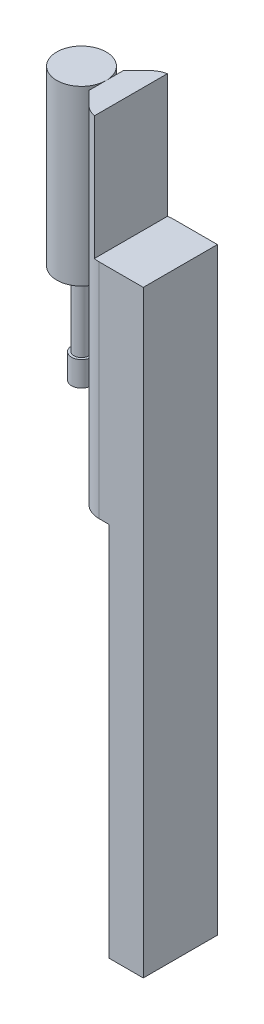
ISO-10303-21;
HEADER;
FILE_DESCRIPTION(('STEP AP214'),'2;1');
FILE_NAME('part.step','',(''),(''),'','','');
FILE_SCHEMA(('AUTOMOTIVE_DESIGN { 1 0 10303 214 1 1 1 1 }'));
ENDSEC;
DATA;
#1=APPLICATION_CONTEXT('core data for automotive mechanical design processes');
#2=APPLICATION_PROTOCOL_DEFINITION('international standard','automotive_design',2000,#1);
#3=PRODUCT_CONTEXT('',#1,'mechanical');
#4=PRODUCT('Part','Part','',(#3));
#5=PRODUCT_RELATED_PRODUCT_CATEGORY('part','',(#4));
#6=PRODUCT_DEFINITION_FORMATION('','',#4);
#7=PRODUCT_DEFINITION_CONTEXT('part definition',#1,'design');
#8=PRODUCT_DEFINITION('design','',#6,#7);
#9=PRODUCT_DEFINITION_SHAPE('','',#8);
#10=(LENGTH_UNIT() NAMED_UNIT(*) SI_UNIT(.MILLI.,.METRE.));
#11=(NAMED_UNIT(*) PLANE_ANGLE_UNIT() SI_UNIT($,.RADIAN.));
#12=(NAMED_UNIT(*) SI_UNIT($,.STERADIAN.) SOLID_ANGLE_UNIT());
#13=UNCERTAINTY_MEASURE_WITH_UNIT(LENGTH_MEASURE(1.E-05),#10,'distance_accuracy_value','');
#14=(GEOMETRIC_REPRESENTATION_CONTEXT(3) GLOBAL_UNCERTAINTY_ASSIGNED_CONTEXT((#13)) GLOBAL_UNIT_ASSIGNED_CONTEXT((#10,
#11,#12)) REPRESENTATION_CONTEXT('',''));
#15=CARTESIAN_POINT('',(0.,0.,0.));
#16=DIRECTION('',(0.,0.,1.));
#17=DIRECTION('',(1.,0.,0.));
#18=AXIS2_PLACEMENT_3D('',#15,#16,#17);
#19=CARTESIAN_POINT('',(-10.,70.,-15.));
#20=DIRECTION('',(0.,1.,0.));
#21=DIRECTION('',(0.,0.,1.));
#22=AXIS2_PLACEMENT_3D('',#19,#20,#21);
#23=CYLINDRICAL_SURFACE('',#22,10.);
#24=CARTESIAN_POINT('',(-10.,70.,-15.));
#25=DIRECTION('',(0.,1.,0.));
#26=DIRECTION('',(0.,0.,1.));
#27=AXIS2_PLACEMENT_3D('',#24,#25,#26);
#28=CIRCLE('',#27,10.);
#29=CARTESIAN_POINT('',(-10.,70.,-5.));
#30=VERTEX_POINT('',#29);
#31=EDGE_CURVE('E47',#30,#30,#28,.T.);
#32=ORIENTED_EDGE('',*,*,#31,.T.);
#33=EDGE_LOOP('',(#32));
#34=FACE_BOUND('',#33,.T.);
#35=CARTESIAN_POINT('',(-10.,140.,-15.));
#36=DIRECTION('',(0.,1.,0.));
#37=DIRECTION('',(0.,0.,1.));
#38=AXIS2_PLACEMENT_3D('',#35,#36,#37);
#39=CIRCLE('',#38,10.);
#40=CARTESIAN_POINT('',(-10.,140.,-5.));
#41=VERTEX_POINT('',#40);
#42=EDGE_CURVE('E43',#41,#41,#39,.T.);
#43=ORIENTED_EDGE('',*,*,#42,.F.);
#44=EDGE_LOOP('',(#43));
#45=FACE_BOUND('',#44,.T.);
#46=ADVANCED_FACE('F40',(#34,#45),#23,.T.);
#47=CARTESIAN_POINT('',(0.,70.,0.));
#48=DIRECTION('',(0.,1.,0.));
#49=DIRECTION('',(0.,0.,1.));
#50=AXIS2_PLACEMENT_3D('',#47,#48,#49);
#51=PLANE('',#50);
#52=CARTESIAN_POINT('',(-10.,70.,-15.));
#53=DIRECTION('',(0.,-1.,0.));
#54=DIRECTION('',(0.,0.,-1.));
#55=AXIS2_PLACEMENT_3D('',#52,#53,#54);
#56=CIRCLE('',#55,3.);
#57=CARTESIAN_POINT('',(-10.,70.,-18.));
#58=VERTEX_POINT('',#57);
#59=EDGE_CURVE('E11',#58,#58,#56,.T.);
#60=ORIENTED_EDGE('',*,*,#59,.F.);
#61=EDGE_LOOP('',(#60));
#62=FACE_BOUND('',#61,.T.);
#63=ORIENTED_EDGE('',*,*,#31,.F.);
#64=EDGE_LOOP('',(#63));
#65=FACE_BOUND('',#64,.T.);
#66=ADVANCED_FACE('F81',(#62,#65),#51,.F.);
#67=CARTESIAN_POINT('',(0.,140.,0.));
#68=DIRECTION('',(0.,1.,0.));
#69=DIRECTION('',(0.,0.,1.));
#70=AXIS2_PLACEMENT_3D('',#67,#68,#69);
#71=PLANE('',#70);
#72=ORIENTED_EDGE('',*,*,#42,.T.);
#73=EDGE_LOOP('',(#72));
#74=FACE_BOUND('',#73,.T.);
#75=ADVANCED_FACE('F86',(#74),#71,.T.);
#76=CARTESIAN_POINT('',(-10.,40.,-15.));
#77=DIRECTION('',(0.,1.,0.));
#78=DIRECTION('',(0.,0.,1.));
#79=AXIS2_PLACEMENT_3D('',#76,#77,#78);
#80=CYLINDRICAL_SURFACE('',#79,3.);
#81=CARTESIAN_POINT('',(-10.,40.,-15.));
#82=DIRECTION('',(0.,-1.,0.));
#83=DIRECTION('',(0.,0.,-1.));
#84=AXIS2_PLACEMENT_3D('',#81,#82,#83);
#85=CIRCLE('',#84,3.);
#86=CARTESIAN_POINT('',(-10.,40.,-18.));
#87=VERTEX_POINT('',#86);
#88=EDGE_CURVE('E53',#87,#87,#85,.T.);
#89=ORIENTED_EDGE('',*,*,#88,.F.);
#90=EDGE_LOOP('',(#89));
#91=FACE_BOUND('',#90,.T.);
#92=ORIENTED_EDGE('',*,*,#59,.T.);
#93=EDGE_LOOP('',(#92));
#94=FACE_BOUND('',#93,.T.);
#95=ADVANCED_FACE('F68',(#91,#94),#80,.T.);
#96=CARTESIAN_POINT('',(-10.,30.,-15.));
#97=DIRECTION('',(0.,1.,0.));
#98=DIRECTION('',(0.,0.,1.));
#99=AXIS2_PLACEMENT_3D('',#96,#97,#98);
#100=CYLINDRICAL_SURFACE('',#99,4.);
#101=CARTESIAN_POINT('',(-10.,30.,-15.));
#102=DIRECTION('',(0.,-1.,0.));
#103=DIRECTION('',(0.,0.,-1.));
#104=AXIS2_PLACEMENT_3D('',#101,#102,#103);
#105=CIRCLE('',#104,4.);
#106=CARTESIAN_POINT('',(-10.,30.,-19.));
#107=VERTEX_POINT('',#106);
#108=EDGE_CURVE('E56',#107,#107,#105,.T.);
#109=ORIENTED_EDGE('',*,*,#108,.F.);
#110=EDGE_LOOP('',(#109));
#111=FACE_BOUND('',#110,.T.);
#112=CARTESIAN_POINT('',(-10.,40.,-15.));
#113=DIRECTION('',(0.,-1.,0.));
#114=DIRECTION('',(0.,0.,-1.));
#115=AXIS2_PLACEMENT_3D('',#112,#113,#114);
#116=CIRCLE('',#115,4.);
#117=CARTESIAN_POINT('',(-10.,40.,-19.));
#118=VERTEX_POINT('',#117);
#119=EDGE_CURVE('E57',#118,#118,#116,.T.);
#120=ORIENTED_EDGE('',*,*,#119,.T.);
#121=EDGE_LOOP('',(#120));
#122=FACE_BOUND('',#121,.T.);
#123=ADVANCED_FACE('F65',(#111,#122),#100,.T.);
#124=CARTESIAN_POINT('',(-10.,30.,-15.));
#125=DIRECTION('',(0.,-1.,0.));
#126=DIRECTION('',(0.,0.,-1.));
#127=AXIS2_PLACEMENT_3D('',#124,#125,#126);
#128=PLANE('',#127);
#129=ORIENTED_EDGE('',*,*,#108,.T.);
#130=EDGE_LOOP('',(#129));
#131=FACE_BOUND('',#130,.T.);
#132=ADVANCED_FACE('F63',(#131),#128,.T.);
#133=CARTESIAN_POINT('',(-10.,40.,-15.));
#134=DIRECTION('',(0.,-1.,0.));
#135=DIRECTION('',(0.,0.,-1.));
#136=AXIS2_PLACEMENT_3D('',#133,#134,#135);
#137=PLANE('',#136);
#138=ORIENTED_EDGE('',*,*,#88,.T.);
#139=EDGE_LOOP('',(#138));
#140=FACE_BOUND('',#139,.T.);
#141=ORIENTED_EDGE('',*,*,#119,.F.);
#142=EDGE_LOOP('',(#141));
#143=FACE_BOUND('',#142,.T.);
#144=ADVANCED_FACE('F72',(#140,#143),#137,.F.);
#145=CLOSED_SHELL('',(#46,#66,#75,#95,#123,#132,#144));
#146=MANIFOLD_SOLID_BREP('B2',#145);
#147=CARTESIAN_POINT('',(0.,90.,0.));
#148=DIRECTION('',(0.,-1.,0.));
#149=DIRECTION('',(0.,0.,-1.));
#150=AXIS2_PLACEMENT_3D('',#147,#148,#149);
#151=PLANE('',#150);
#152=DIRECTION('',(-1.,0.,0.));
#153=VECTOR('',#152,1.);
#154=CARTESIAN_POINT('',(0.,90.,-30.));
#155=LINE('',#154,#153);
#156=CARTESIAN_POINT('',(30.,90.,-30.));
#157=VERTEX_POINT('',#156);
#158=CARTESIAN_POINT('',(12.1421356237309,90.,-30.));
#159=VERTEX_POINT('',#158);
#160=EDGE_CURVE('E277',#157,#159,#155,.T.);
#161=ORIENTED_EDGE('',*,*,#160,.T.);
#162=CARTESIAN_POINT('',(12.1421356237309,90.,-20.));
#163=DIRECTION('',(0.,-1.,0.));
#164=DIRECTION('',(0.,0.,-1.));
#165=AXIS2_PLACEMENT_3D('',#162,#163,#164);
#166=CIRCLE('',#165,10.);
#167=CARTESIAN_POINT('',(10.,90.,-29.7678684967368));
#168=VERTEX_POINT('',#167);
#169=EDGE_CURVE('E305',#159,#168,#166,.F.);
#170=ORIENTED_EDGE('',*,*,#169,.T.);
#171=DIRECTION('',(0.,0.,-1.));
#172=VECTOR('',#171,1.);
#173=CARTESIAN_POINT('',(10.,90.,0.));
#174=LINE('',#173,#172);
#175=CARTESIAN_POINT('',(10.,90.,-0.232131503263216));
#176=VERTEX_POINT('',#175);
#177=EDGE_CURVE('E264',#176,#168,#174,.T.);
#178=ORIENTED_EDGE('',*,*,#177,.F.);
#179=CARTESIAN_POINT('',(12.1421356237309,90.,-10.));
#180=DIRECTION('',(0.,-1.,0.));
#181=DIRECTION('',(0.,0.,-1.));
#182=AXIS2_PLACEMENT_3D('',#179,#180,#181);
#183=CIRCLE('',#182,10.);
#184=CARTESIAN_POINT('',(12.1421356237309,90.,0.));
#185=VERTEX_POINT('',#184);
#186=EDGE_CURVE('E303',#176,#185,#183,.F.);
#187=ORIENTED_EDGE('',*,*,#186,.T.);
#188=DIRECTION('',(1.,0.,0.));
#189=VECTOR('',#188,1.);
#190=CARTESIAN_POINT('',(0.,90.,0.));
#191=LINE('',#190,#189);
#192=CARTESIAN_POINT('',(30.,90.,0.));
#193=VERTEX_POINT('',#192);
#194=EDGE_CURVE('E273',#185,#193,#191,.T.);
#195=ORIENTED_EDGE('',*,*,#194,.T.);
#196=DIRECTION('',(0.,0.,-1.));
#197=VECTOR('',#196,1.);
#198=CARTESIAN_POINT('',(30.,90.,0.));
#199=LINE('',#198,#197);
#200=EDGE_CURVE('E235',#193,#157,#199,.T.);
#201=ORIENTED_EDGE('',*,*,#200,.T.);
#202=EDGE_LOOP('',(#161,#170,#178,#187,#195,#201));
#203=FACE_BOUND('',#202,.T.);
#204=ADVANCED_FACE('F141',(#203),#151,.F.);
#205=CARTESIAN_POINT('',(0.,90.,0.));
#206=DIRECTION('',(1.,0.,0.));
#207=DIRECTION('',(0.,0.,-1.));
#208=AXIS2_PLACEMENT_3D('',#205,#206,#207);
#209=PLANE('',#208);
#210=DIRECTION('',(0.,0.,1.));
#211=VECTOR('',#210,1.);
#212=CARTESIAN_POINT('',(0.,140.,0.));
#213=LINE('',#212,#211);
#214=CARTESIAN_POINT('',(0.,140.,-22.));
#215=VERTEX_POINT('',#214);
#216=CARTESIAN_POINT('',(0.,140.,-8.));
#217=VERTEX_POINT('',#216);
#218=EDGE_CURVE('E263',#215,#217,#213,.T.);
#219=ORIENTED_EDGE('',*,*,#218,.F.);
#220=DIRECTION('',(0.,-1.,0.));
#221=VECTOR('',#220,1.);
#222=CARTESIAN_POINT('',(0.,90.,-22.));
#223=LINE('',#222,#221);
#224=CARTESIAN_POINT('',(0.,0.,-22.));
#225=VERTEX_POINT('',#224);
#226=EDGE_CURVE('E287',#215,#225,#223,.T.);
#227=ORIENTED_EDGE('',*,*,#226,.T.);
#228=DIRECTION('',(0.,0.,1.));
#229=VECTOR('',#228,1.);
#230=CARTESIAN_POINT('',(0.,0.,0.));
#231=LINE('',#230,#229);
#232=CARTESIAN_POINT('',(0.,0.,-8.));
#233=VERTEX_POINT('',#232);
#234=EDGE_CURVE('E270',#225,#233,#231,.T.);
#235=ORIENTED_EDGE('',*,*,#234,.T.);
#236=DIRECTION('',(0.,1.,0.));
#237=VECTOR('',#236,1.);
#238=CARTESIAN_POINT('',(0.,90.,-8.));
#239=LINE('',#238,#237);
#240=EDGE_CURVE('E238',#233,#217,#239,.T.);
#241=ORIENTED_EDGE('',*,*,#240,.T.);
#242=EDGE_LOOP('',(#219,#227,#235,#241));
#243=FACE_BOUND('',#242,.T.);
#244=ADVANCED_FACE('F342',(#243),#209,.F.);
#245=CARTESIAN_POINT('',(0.,90.,0.));
#246=DIRECTION('',(0.,0.,-1.));
#247=DIRECTION('',(-1.,0.,0.));
#248=AXIS2_PLACEMENT_3D('',#245,#246,#247);
#249=PLANE('',#248);
#250=ORIENTED_EDGE('',*,*,#194,.F.);
#251=DIRECTION('',(0.,1.,0.));
#252=VECTOR('',#251,1.);
#253=CARTESIAN_POINT('',(12.1421356237309,0.,0.));
#254=LINE('',#253,#252);
#255=CARTESIAN_POINT('',(12.1421356237309,0.,0.));
#256=VERTEX_POINT('',#255);
#257=EDGE_CURVE('E149',#185,#256,#254,.F.);
#258=ORIENTED_EDGE('',*,*,#257,.T.);
#259=DIRECTION('',(1.,0.,0.));
#260=VECTOR('',#259,1.);
#261=CARTESIAN_POINT('',(0.,0.,0.));
#262=LINE('',#261,#260);
#263=CARTESIAN_POINT('',(16.1901209101529,0.,0.));
#264=VERTEX_POINT('',#263);
#265=EDGE_CURVE('E282',#256,#264,#262,.T.);
#266=ORIENTED_EDGE('',*,*,#265,.T.);
#267=DIRECTION('',(0.,1.,0.));
#268=VECTOR('',#267,1.);
#269=CARTESIAN_POINT('',(16.1901209101529,-152.,0.));
#270=LINE('',#269,#268);
#271=CARTESIAN_POINT('',(16.1901209101529,-152.,0.));
#272=VERTEX_POINT('',#271);
#273=EDGE_CURVE('E245',#272,#264,#270,.T.);
#274=ORIENTED_EDGE('',*,*,#273,.F.);
#275=DIRECTION('',(-1.,0.,0.));
#276=VECTOR('',#275,1.);
#277=CARTESIAN_POINT('',(30.,-152.,0.));
#278=LINE('',#277,#276);
#279=CARTESIAN_POINT('',(30.,-152.,0.));
#280=VERTEX_POINT('',#279);
#281=EDGE_CURVE('E242',#280,#272,#278,.T.);
#282=ORIENTED_EDGE('',*,*,#281,.F.);
#283=DIRECTION('',(0.,-1.,0.));
#284=VECTOR('',#283,1.);
#285=CARTESIAN_POINT('',(30.,90.,0.));
#286=LINE('',#285,#284);
#287=EDGE_CURVE('E229',#193,#280,#286,.T.);
#288=ORIENTED_EDGE('',*,*,#287,.F.);
#289=EDGE_LOOP('',(#250,#258,#266,#274,#282,#288));
#290=FACE_BOUND('',#289,.T.);
#291=ADVANCED_FACE('F243',(#290),#249,.F.);
#292=CARTESIAN_POINT('',(30.,90.,0.));
#293=DIRECTION('',(-1.,0.,0.));
#294=DIRECTION('',(0.,0.,1.));
#295=AXIS2_PLACEMENT_3D('',#292,#293,#294);
#296=PLANE('',#295);
#297=ORIENTED_EDGE('',*,*,#287,.T.);
#298=DIRECTION('',(0.,0.,1.));
#299=VECTOR('',#298,1.);
#300=CARTESIAN_POINT('',(30.,-152.,0.));
#301=LINE('',#300,#299);
#302=CARTESIAN_POINT('',(30.,-152.,-30.));
#303=VERTEX_POINT('',#302);
#304=EDGE_CURVE('E234',#303,#280,#301,.T.);
#305=ORIENTED_EDGE('',*,*,#304,.F.);
#306=DIRECTION('',(0.,-1.,0.));
#307=VECTOR('',#306,1.);
#308=CARTESIAN_POINT('',(30.,90.,-30.));
#309=LINE('',#308,#307);
#310=EDGE_CURVE('E239',#157,#303,#309,.T.);
#311=ORIENTED_EDGE('',*,*,#310,.F.);
#312=ORIENTED_EDGE('',*,*,#200,.F.);
#313=EDGE_LOOP('',(#297,#305,#311,#312));
#314=FACE_BOUND('',#313,.T.);
#315=ADVANCED_FACE('F231',(#314),#296,.F.);
#316=CARTESIAN_POINT('',(0.,90.,-30.));
#317=DIRECTION('',(0.,0.,1.));
#318=DIRECTION('',(1.,0.,0.));
#319=AXIS2_PLACEMENT_3D('',#316,#317,#318);
#320=PLANE('',#319);
#321=ORIENTED_EDGE('',*,*,#310,.T.);
#322=DIRECTION('',(1.,0.,0.));
#323=VECTOR('',#322,1.);
#324=CARTESIAN_POINT('',(30.,-152.,-30.));
#325=LINE('',#324,#323);
#326=CARTESIAN_POINT('',(16.1901209101529,-152.,-30.));
#327=VERTEX_POINT('',#326);
#328=EDGE_CURVE('E253',#327,#303,#325,.T.);
#329=ORIENTED_EDGE('',*,*,#328,.F.);
#330=DIRECTION('',(0.,1.,0.));
#331=VECTOR('',#330,1.);
#332=CARTESIAN_POINT('',(16.1901209101529,-152.,-30.));
#333=LINE('',#332,#331);
#334=CARTESIAN_POINT('',(16.1901209101529,0.,-30.));
#335=VERTEX_POINT('',#334);
#336=EDGE_CURVE('E258',#327,#335,#333,.T.);
#337=ORIENTED_EDGE('',*,*,#336,.T.);
#338=DIRECTION('',(-1.,0.,0.));
#339=VECTOR('',#338,1.);
#340=CARTESIAN_POINT('',(0.,0.,-30.));
#341=LINE('',#340,#339);
#342=CARTESIAN_POINT('',(12.1421356237309,0.,-30.));
#343=VERTEX_POINT('',#342);
#344=EDGE_CURVE('E275',#335,#343,#341,.T.);
#345=ORIENTED_EDGE('',*,*,#344,.T.);
#346=DIRECTION('',(0.,-1.,0.));
#347=VECTOR('',#346,1.);
#348=CARTESIAN_POINT('',(12.1421356237309,140.,-30.));
#349=LINE('',#348,#347);
#350=EDGE_CURVE('E300',#343,#159,#349,.F.);
#351=ORIENTED_EDGE('',*,*,#350,.T.);
#352=ORIENTED_EDGE('',*,*,#160,.F.);
#353=EDGE_LOOP('',(#321,#329,#337,#345,#351,#352));
#354=FACE_BOUND('',#353,.T.);
#355=ADVANCED_FACE('F327',(#354),#320,.F.);
#356=CARTESIAN_POINT('',(0.,0.,0.));
#357=DIRECTION('',(0.,-1.,0.));
#358=DIRECTION('',(0.,0.,-1.));
#359=AXIS2_PLACEMENT_3D('',#356,#357,#358);
#360=PLANE('',#359);
#361=DIRECTION('',(0.,0.,-1.));
#362=VECTOR('',#361,1.);
#363=CARTESIAN_POINT('',(16.1901209101529,0.,0.));
#364=LINE('',#363,#362);
#365=EDGE_CURVE('E156',#264,#335,#364,.T.);
#366=ORIENTED_EDGE('',*,*,#365,.F.);
#367=ORIENTED_EDGE('',*,*,#265,.F.);
#368=CARTESIAN_POINT('',(12.1421356237309,0.,-10.));
#369=DIRECTION('',(0.,-1.,0.));
#370=DIRECTION('',(0.,0.,-1.));
#371=AXIS2_PLACEMENT_3D('',#368,#369,#370);
#372=CIRCLE('',#371,10.);
#373=CARTESIAN_POINT('',(5.07106781186545,0.,-2.92893218813454));
#374=VERTEX_POINT('',#373);
#375=EDGE_CURVE('E162',#256,#374,#372,.T.);
#376=ORIENTED_EDGE('',*,*,#375,.T.);
#377=DIRECTION('',(0.707106781186546,0.,0.707106781186549));
#378=VECTOR('',#377,1.);
#379=CARTESIAN_POINT('',(4.,0.,-3.99999999999999));
#380=LINE('',#379,#378);
#381=EDGE_CURVE('E290',#374,#233,#380,.F.);
#382=ORIENTED_EDGE('',*,*,#381,.T.);
#383=ORIENTED_EDGE('',*,*,#234,.F.);
#384=DIRECTION('',(-0.707106781186548,0.,0.707106781186547));
#385=VECTOR('',#384,1.);
#386=CARTESIAN_POINT('',(-11.,0.,-11.));
#387=LINE('',#386,#385);
#388=CARTESIAN_POINT('',(5.07106781186548,0.,-27.0710678118655));
#389=VERTEX_POINT('',#388);
#390=EDGE_CURVE('E292',#225,#389,#387,.F.);
#391=ORIENTED_EDGE('',*,*,#390,.T.);
#392=CARTESIAN_POINT('',(12.1421356237309,0.,-20.));
#393=DIRECTION('',(0.,-1.,0.));
#394=DIRECTION('',(0.,0.,-1.));
#395=AXIS2_PLACEMENT_3D('',#392,#393,#394);
#396=CIRCLE('',#395,10.);
#397=EDGE_CURVE('E318',#389,#343,#396,.T.);
#398=ORIENTED_EDGE('',*,*,#397,.T.);
#399=ORIENTED_EDGE('',*,*,#344,.F.);
#400=EDGE_LOOP('',(#366,#367,#376,#382,#383,#391,#398,#399));
#401=FACE_BOUND('',#400,.T.);
#402=ADVANCED_FACE('F324',(#401),#360,.T.);
#403=CARTESIAN_POINT('',(10.,140.,0.));
#404=DIRECTION('',(0.,-1.,0.));
#405=DIRECTION('',(0.,0.,-1.));
#406=AXIS2_PLACEMENT_3D('',#403,#404,#405);
#407=PLANE('',#406);
#408=DIRECTION('',(0.,0.,1.));
#409=VECTOR('',#408,1.);
#410=CARTESIAN_POINT('',(10.,140.,0.));
#411=LINE('',#410,#409);
#412=CARTESIAN_POINT('',(10.,140.,-29.7678684967368));
#413=VERTEX_POINT('',#412);
#414=CARTESIAN_POINT('',(10.,140.,-0.232131503263216));
#415=VERTEX_POINT('',#414);
#416=EDGE_CURVE('E267',#413,#415,#411,.T.);
#417=ORIENTED_EDGE('',*,*,#416,.F.);
#418=CARTESIAN_POINT('',(12.1421356237309,140.,-20.));
#419=DIRECTION('',(0.,-1.,0.));
#420=DIRECTION('',(0.,0.,-1.));
#421=AXIS2_PLACEMENT_3D('',#418,#419,#420);
#422=CIRCLE('',#421,10.);
#423=CARTESIAN_POINT('',(5.07106781186548,140.,-27.0710678118655));
#424=VERTEX_POINT('',#423);
#425=EDGE_CURVE('E313',#413,#424,#422,.F.);
#426=ORIENTED_EDGE('',*,*,#425,.T.);
#427=DIRECTION('',(0.707106781186548,0.,-0.707106781186547));
#428=VECTOR('',#427,1.);
#429=CARTESIAN_POINT('',(0.,140.,-22.));
#430=LINE('',#429,#428);
#431=EDGE_CURVE('E298',#424,#215,#430,.F.);
#432=ORIENTED_EDGE('',*,*,#431,.T.);
#433=ORIENTED_EDGE('',*,*,#218,.T.);
#434=DIRECTION('',(-0.707106781186546,0.,-0.707106781186549));
#435=VECTOR('',#434,1.);
#436=CARTESIAN_POINT('',(7.99999999999997,140.,0.));
#437=LINE('',#436,#435);
#438=CARTESIAN_POINT('',(5.07106781186545,140.,-2.92893218813454));
#439=VERTEX_POINT('',#438);
#440=EDGE_CURVE('E295',#217,#439,#437,.F.);
#441=ORIENTED_EDGE('',*,*,#440,.T.);
#442=CARTESIAN_POINT('',(12.1421356237309,140.,-10.));
#443=DIRECTION('',(0.,-1.,0.));
#444=DIRECTION('',(0.,0.,-1.));
#445=AXIS2_PLACEMENT_3D('',#442,#443,#444);
#446=CIRCLE('',#445,10.);
#447=EDGE_CURVE('E311',#439,#415,#446,.F.);
#448=ORIENTED_EDGE('',*,*,#447,.T.);
#449=EDGE_LOOP('',(#417,#426,#432,#433,#441,#448));
#450=FACE_BOUND('',#449,.T.);
#451=ADVANCED_FACE('F326',(#450),#407,.F.);
#452=CARTESIAN_POINT('',(10.,0.,0.));
#453=DIRECTION('',(-1.,0.,0.));
#454=DIRECTION('',(0.,0.,1.));
#455=AXIS2_PLACEMENT_3D('',#452,#453,#454);
#456=PLANE('',#455);
#457=ORIENTED_EDGE('',*,*,#177,.T.);
#458=DIRECTION('',(0.,1.,0.));
#459=VECTOR('',#458,1.);
#460=CARTESIAN_POINT('',(10.,90.,-29.7678684967368));
#461=LINE('',#460,#459);
#462=EDGE_CURVE('E309',#168,#413,#461,.T.);
#463=ORIENTED_EDGE('',*,*,#462,.T.);
#464=ORIENTED_EDGE('',*,*,#416,.T.);
#465=DIRECTION('',(0.,-1.,0.));
#466=VECTOR('',#465,1.);
#467=CARTESIAN_POINT('',(10.,140.,-0.232131503263216));
#468=LINE('',#467,#466);
#469=EDGE_CURVE('E307',#415,#176,#468,.T.);
#470=ORIENTED_EDGE('',*,*,#469,.T.);
#471=EDGE_LOOP('',(#457,#463,#464,#470));
#472=FACE_BOUND('',#471,.T.);
#473=ADVANCED_FACE('F334',(#472),#456,.F.);
#474=CARTESIAN_POINT('',(0.,90.,-22.));
#475=DIRECTION('',(0.707106781186547,0.,0.707106781186548));
#476=DIRECTION('',(0.,-1.,0.));
#477=AXIS2_PLACEMENT_3D('',#474,#475,#476);
#478=PLANE('',#477);
#479=ORIENTED_EDGE('',*,*,#431,.F.);
#480=DIRECTION('',(0.,1.,0.));
#481=VECTOR('',#480,1.);
#482=CARTESIAN_POINT('',(5.07106781186548,0.,-27.0710678118655));
#483=LINE('',#482,#481);
#484=EDGE_CURVE('E315',#424,#389,#483,.F.);
#485=ORIENTED_EDGE('',*,*,#484,.T.);
#486=ORIENTED_EDGE('',*,*,#390,.F.);
#487=ORIENTED_EDGE('',*,*,#226,.F.);
#488=EDGE_LOOP('',(#479,#485,#486,#487));
#489=FACE_BOUND('',#488,.T.);
#490=ADVANCED_FACE('F352',(#489),#478,.F.);
#491=CARTESIAN_POINT('',(7.99999999999997,90.,0.));
#492=DIRECTION('',(0.707106781186549,0.,-0.707106781186546));
#493=DIRECTION('',(0.,-1.,0.));
#494=AXIS2_PLACEMENT_3D('',#491,#492,#493);
#495=PLANE('',#494);
#496=ORIENTED_EDGE('',*,*,#381,.F.);
#497=DIRECTION('',(0.,-1.,0.));
#498=VECTOR('',#497,1.);
#499=CARTESIAN_POINT('',(5.07106781186545,140.,-2.92893218813454));
#500=LINE('',#499,#498);
#501=EDGE_CURVE('E38',#374,#439,#500,.F.);
#502=ORIENTED_EDGE('',*,*,#501,.T.);
#503=ORIENTED_EDGE('',*,*,#440,.F.);
#504=ORIENTED_EDGE('',*,*,#240,.F.);
#505=EDGE_LOOP('',(#496,#502,#503,#504));
#506=FACE_BOUND('',#505,.T.);
#507=ADVANCED_FACE('F391',(#506),#495,.F.);
#508=CARTESIAN_POINT('',(12.1421356237309,90.,-20.));
#509=DIRECTION('',(0.,1.,0.));
#510=DIRECTION('',(0.,0.,1.));
#511=AXIS2_PLACEMENT_3D('',#508,#509,#510);
#512=CYLINDRICAL_SURFACE('',#511,10.);
#513=ORIENTED_EDGE('',*,*,#397,.F.);
#514=ORIENTED_EDGE('',*,*,#484,.F.);
#515=ORIENTED_EDGE('',*,*,#425,.F.);
#516=ORIENTED_EDGE('',*,*,#462,.F.);
#517=ORIENTED_EDGE('',*,*,#169,.F.);
#518=ORIENTED_EDGE('',*,*,#350,.F.);
#519=EDGE_LOOP('',(#513,#514,#515,#516,#517,#518));
#520=FACE_BOUND('',#519,.T.);
#521=ADVANCED_FACE('F385',(#520),#512,.T.);
#522=CARTESIAN_POINT('',(12.1421356237309,90.,-10.));
#523=DIRECTION('',(0.,-1.,0.));
#524=DIRECTION('',(0.,0.,-1.));
#525=AXIS2_PLACEMENT_3D('',#522,#523,#524);
#526=CYLINDRICAL_SURFACE('',#525,10.);
#527=ORIENTED_EDGE('',*,*,#447,.F.);
#528=ORIENTED_EDGE('',*,*,#501,.F.);
#529=ORIENTED_EDGE('',*,*,#375,.F.);
#530=ORIENTED_EDGE('',*,*,#257,.F.);
#531=ORIENTED_EDGE('',*,*,#186,.F.);
#532=ORIENTED_EDGE('',*,*,#469,.F.);
#533=EDGE_LOOP('',(#527,#528,#529,#530,#531,#532));
#534=FACE_BOUND('',#533,.T.);
#535=ADVANCED_FACE('F143',(#534),#526,.T.);
#536=CARTESIAN_POINT('',(16.1901209101529,-152.,0.));
#537=DIRECTION('',(1.,0.,0.));
#538=DIRECTION('',(0.,0.,-1.));
#539=AXIS2_PLACEMENT_3D('',#536,#537,#538);
#540=PLANE('',#539);
#541=ORIENTED_EDGE('',*,*,#365,.T.);
#542=ORIENTED_EDGE('',*,*,#336,.F.);
#543=DIRECTION('',(0.,0.,-1.));
#544=VECTOR('',#543,1.);
#545=CARTESIAN_POINT('',(16.1901209101529,-152.,0.));
#546=LINE('',#545,#544);
#547=EDGE_CURVE('E248',#272,#327,#546,.T.);
#548=ORIENTED_EDGE('',*,*,#547,.F.);
#549=ORIENTED_EDGE('',*,*,#273,.T.);
#550=EDGE_LOOP('',(#541,#542,#548,#549));
#551=FACE_BOUND('',#550,.T.);
#552=ADVANCED_FACE('F354',(#551),#540,.F.);
#553=CARTESIAN_POINT('',(0.,-152.,0.));
#554=DIRECTION('',(0.,1.,0.));
#555=DIRECTION('',(0.,0.,1.));
#556=AXIS2_PLACEMENT_3D('',#553,#554,#555);
#557=PLANE('',#556);
#558=ORIENTED_EDGE('',*,*,#304,.T.);
#559=ORIENTED_EDGE('',*,*,#281,.T.);
#560=ORIENTED_EDGE('',*,*,#547,.T.);
#561=ORIENTED_EDGE('',*,*,#328,.T.);
#562=EDGE_LOOP('',(#558,#559,#560,#561));
#563=FACE_BOUND('',#562,.T.);
#564=ADVANCED_FACE('F251',(#563),#557,.F.);
#565=CLOSED_SHELL('',(#204,#244,#291,#315,#355,#402,#451,#473,#490,#507,#521,#535,#552,#564));
#566=MANIFOLD_SOLID_BREP('B6',#565);
#567=ADVANCED_BREP_SHAPE_REPRESENTATION('',(#18,#146,#566),#14);
#568=SHAPE_DEFINITION_REPRESENTATION(#9,#567);
ENDSEC;
END-ISO-10303-21;
